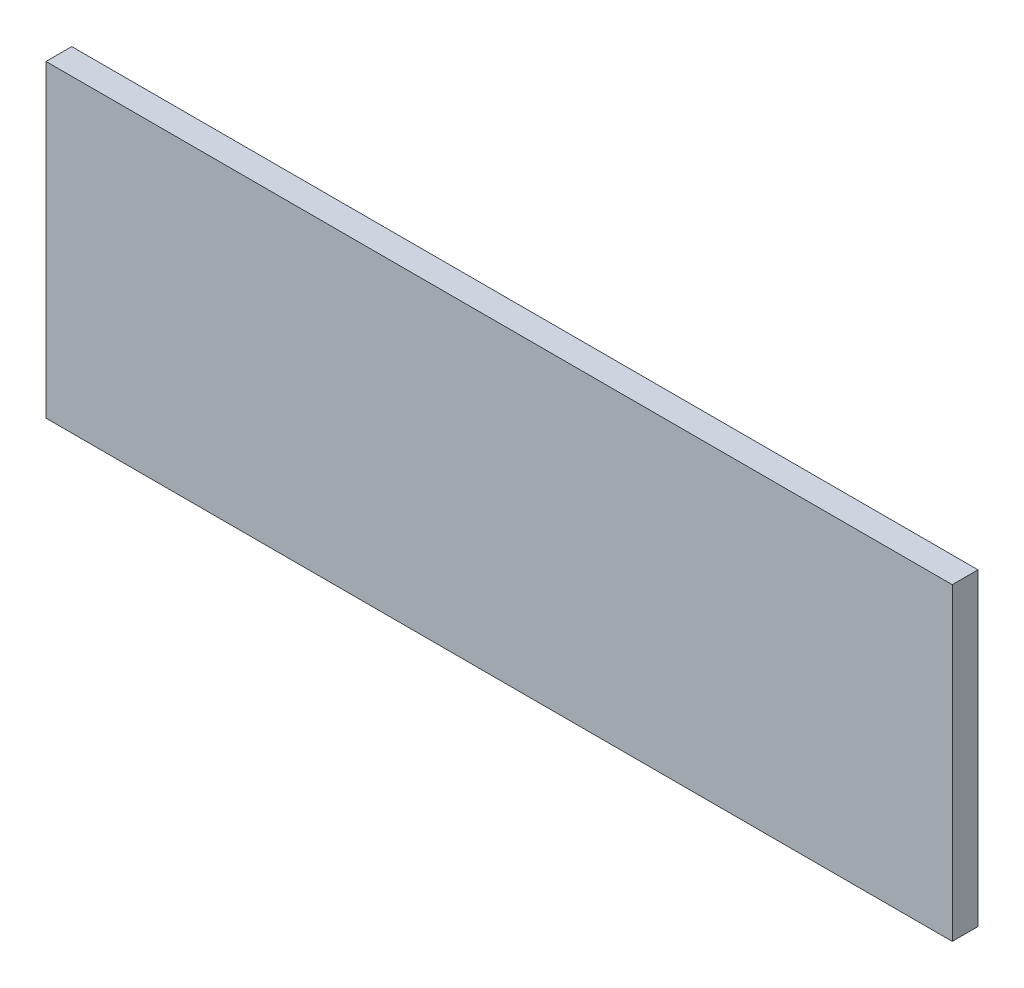
ISO-10303-21;
HEADER;
FILE_DESCRIPTION(('STEP AP214'),'2;1');
FILE_NAME('part.step','',(''),(''),'','','');
FILE_SCHEMA(('AUTOMOTIVE_DESIGN { 1 0 10303 214 1 1 1 1 }'));
ENDSEC;
DATA;
#1=APPLICATION_CONTEXT('core data for automotive mechanical design processes');
#2=APPLICATION_PROTOCOL_DEFINITION('international standard','automotive_design',2000,#1);
#3=PRODUCT_CONTEXT('',#1,'mechanical');
#4=PRODUCT('Part','Part','',(#3));
#5=PRODUCT_RELATED_PRODUCT_CATEGORY('part','',(#4));
#6=PRODUCT_DEFINITION_FORMATION('','',#4);
#7=PRODUCT_DEFINITION_CONTEXT('part definition',#1,'design');
#8=PRODUCT_DEFINITION('design','',#6,#7);
#9=PRODUCT_DEFINITION_SHAPE('','',#8);
#10=(LENGTH_UNIT() NAMED_UNIT(*) SI_UNIT(.MILLI.,.METRE.));
#11=(NAMED_UNIT(*) PLANE_ANGLE_UNIT() SI_UNIT($,.RADIAN.));
#12=(NAMED_UNIT(*) SI_UNIT($,.STERADIAN.) SOLID_ANGLE_UNIT());
#13=UNCERTAINTY_MEASURE_WITH_UNIT(LENGTH_MEASURE(1.E-05),#10,'distance_accuracy_value','');
#14=(GEOMETRIC_REPRESENTATION_CONTEXT(3) GLOBAL_UNCERTAINTY_ASSIGNED_CONTEXT((#13)) GLOBAL_UNIT_ASSIGNED_CONTEXT((#10,
#11,#12)) REPRESENTATION_CONTEXT('',''));
#15=CARTESIAN_POINT('',(0.,0.,0.));
#16=DIRECTION('',(0.,0.,1.));
#17=DIRECTION('',(1.,0.,0.));
#18=AXIS2_PLACEMENT_3D('',#15,#16,#17);
#19=CARTESIAN_POINT('',(88.,-30.,5.));
#20=DIRECTION('',(-1.,0.,0.));
#21=DIRECTION('',(0.,0.,1.));
#22=AXIS2_PLACEMENT_3D('',#19,#20,#21);
#23=PLANE('',#22);
#24=DIRECTION('',(0.,1.,0.));
#25=VECTOR('',#24,1.);
#26=CARTESIAN_POINT('',(88.,-30.,0.));
#27=LINE('',#26,#25);
#28=CARTESIAN_POINT('',(88.,-30.,0.));
#29=VERTEX_POINT('',#28);
#30=CARTESIAN_POINT('',(88.,30.,0.));
#31=VERTEX_POINT('',#30);
#32=EDGE_CURVE('E96',#29,#31,#27,.T.);
#33=ORIENTED_EDGE('',*,*,#32,.T.);
#34=DIRECTION('',(0.,0.,-1.));
#35=VECTOR('',#34,1.);
#36=CARTESIAN_POINT('',(88.,30.,5.));
#37=LINE('',#36,#35);
#38=CARTESIAN_POINT('',(88.,30.,5.));
#39=VERTEX_POINT('',#38);
#40=EDGE_CURVE('E11',#39,#31,#37,.T.);
#41=ORIENTED_EDGE('',*,*,#40,.F.);
#42=DIRECTION('',(0.,1.,0.));
#43=VECTOR('',#42,1.);
#44=CARTESIAN_POINT('',(88.,-30.,5.));
#45=LINE('',#44,#43);
#46=CARTESIAN_POINT('',(88.,-30.,5.));
#47=VERTEX_POINT('',#46);
#48=EDGE_CURVE('E84',#47,#39,#45,.T.);
#49=ORIENTED_EDGE('',*,*,#48,.F.);
#50=DIRECTION('',(0.,0.,-1.));
#51=VECTOR('',#50,1.);
#52=CARTESIAN_POINT('',(88.,-30.,5.));
#53=LINE('',#52,#51);
#54=EDGE_CURVE('E92',#47,#29,#53,.T.);
#55=ORIENTED_EDGE('',*,*,#54,.T.);
#56=EDGE_LOOP('',(#33,#41,#49,#55));
#57=FACE_BOUND('',#56,.T.);
#58=ADVANCED_FACE('F33',(#57),#23,.F.);
#59=CARTESIAN_POINT('',(-88.,30.,5.));
#60=DIRECTION('',(0.,-1.,0.));
#61=DIRECTION('',(0.,0.,-1.));
#62=AXIS2_PLACEMENT_3D('',#59,#60,#61);
#63=PLANE('',#62);
#64=DIRECTION('',(-1.,0.,0.));
#65=VECTOR('',#64,1.);
#66=CARTESIAN_POINT('',(-88.,30.,0.));
#67=LINE('',#66,#65);
#68=CARTESIAN_POINT('',(-88.,30.,0.));
#69=VERTEX_POINT('',#68);
#70=EDGE_CURVE('E88',#31,#69,#67,.T.);
#71=ORIENTED_EDGE('',*,*,#70,.T.);
#72=DIRECTION('',(0.,0.,-1.));
#73=VECTOR('',#72,1.);
#74=CARTESIAN_POINT('',(-88.,30.,5.));
#75=LINE('',#74,#73);
#76=CARTESIAN_POINT('',(-88.,30.,5.));
#77=VERTEX_POINT('',#76);
#78=EDGE_CURVE('E41',#77,#69,#75,.T.);
#79=ORIENTED_EDGE('',*,*,#78,.F.);
#80=DIRECTION('',(-1.,0.,0.));
#81=VECTOR('',#80,1.);
#82=CARTESIAN_POINT('',(-88.,30.,5.));
#83=LINE('',#82,#81);
#84=EDGE_CURVE('E79',#39,#77,#83,.T.);
#85=ORIENTED_EDGE('',*,*,#84,.F.);
#86=ORIENTED_EDGE('',*,*,#40,.T.);
#87=EDGE_LOOP('',(#71,#79,#85,#86));
#88=FACE_BOUND('',#87,.T.);
#89=ADVANCED_FACE('F87',(#88),#63,.F.);
#90=CARTESIAN_POINT('',(-88.,-30.,5.));
#91=DIRECTION('',(1.,0.,0.));
#92=DIRECTION('',(0.,0.,-1.));
#93=AXIS2_PLACEMENT_3D('',#90,#91,#92);
#94=PLANE('',#93);
#95=DIRECTION('',(0.,-1.,0.));
#96=VECTOR('',#95,1.);
#97=CARTESIAN_POINT('',(-88.,-30.,0.));
#98=LINE('',#97,#96);
#99=CARTESIAN_POINT('',(-88.,-30.,0.));
#100=VERTEX_POINT('',#99);
#101=EDGE_CURVE('E66',#69,#100,#98,.T.);
#102=ORIENTED_EDGE('',*,*,#101,.T.);
#103=DIRECTION('',(0.,0.,-1.));
#104=VECTOR('',#103,1.);
#105=CARTESIAN_POINT('',(-88.,-30.,5.));
#106=LINE('',#105,#104);
#107=CARTESIAN_POINT('',(-88.,-30.,5.));
#108=VERTEX_POINT('',#107);
#109=EDGE_CURVE('E89',#108,#100,#106,.T.);
#110=ORIENTED_EDGE('',*,*,#109,.F.);
#111=DIRECTION('',(0.,-1.,0.));
#112=VECTOR('',#111,1.);
#113=CARTESIAN_POINT('',(-88.,-30.,5.));
#114=LINE('',#113,#112);
#115=EDGE_CURVE('E82',#77,#108,#114,.T.);
#116=ORIENTED_EDGE('',*,*,#115,.F.);
#117=ORIENTED_EDGE('',*,*,#78,.T.);
#118=EDGE_LOOP('',(#102,#110,#116,#117));
#119=FACE_BOUND('',#118,.T.);
#120=ADVANCED_FACE('F90',(#119),#94,.F.);
#121=CARTESIAN_POINT('',(-88.,-30.,5.));
#122=DIRECTION('',(0.,1.,0.));
#123=DIRECTION('',(0.,0.,1.));
#124=AXIS2_PLACEMENT_3D('',#121,#122,#123);
#125=PLANE('',#124);
#126=DIRECTION('',(1.,0.,0.));
#127=VECTOR('',#126,1.);
#128=CARTESIAN_POINT('',(-88.,-30.,0.));
#129=LINE('',#128,#127);
#130=EDGE_CURVE('E72',#100,#29,#129,.T.);
#131=ORIENTED_EDGE('',*,*,#130,.T.);
#132=ORIENTED_EDGE('',*,*,#54,.F.);
#133=DIRECTION('',(1.,0.,0.));
#134=VECTOR('',#133,1.);
#135=CARTESIAN_POINT('',(-88.,-30.,5.));
#136=LINE('',#135,#134);
#137=EDGE_CURVE('E49',#108,#47,#136,.T.);
#138=ORIENTED_EDGE('',*,*,#137,.F.);
#139=ORIENTED_EDGE('',*,*,#109,.T.);
#140=EDGE_LOOP('',(#131,#132,#138,#139));
#141=FACE_BOUND('',#140,.T.);
#142=ADVANCED_FACE('F103',(#141),#125,.F.);
#143=CARTESIAN_POINT('',(0.,0.,5.));
#144=DIRECTION('',(0.,0.,-1.));
#145=DIRECTION('',(-1.,0.,0.));
#146=AXIS2_PLACEMENT_3D('',#143,#144,#145);
#147=PLANE('',#146);
#148=ORIENTED_EDGE('',*,*,#48,.T.);
#149=ORIENTED_EDGE('',*,*,#84,.T.);
#150=ORIENTED_EDGE('',*,*,#115,.T.);
#151=ORIENTED_EDGE('',*,*,#137,.T.);
#152=EDGE_LOOP('',(#148,#149,#150,#151));
#153=FACE_BOUND('',#152,.T.);
#154=ADVANCED_FACE('F80',(#153),#147,.F.);
#155=CARTESIAN_POINT('',(0.,0.,0.));
#156=DIRECTION('',(0.,0.,-1.));
#157=DIRECTION('',(-1.,0.,0.));
#158=AXIS2_PLACEMENT_3D('',#155,#156,#157);
#159=PLANE('',#158);
#160=ORIENTED_EDGE('',*,*,#32,.F.);
#161=ORIENTED_EDGE('',*,*,#130,.F.);
#162=ORIENTED_EDGE('',*,*,#101,.F.);
#163=ORIENTED_EDGE('',*,*,#70,.F.);
#164=EDGE_LOOP('',(#160,#161,#162,#163));
#165=FACE_BOUND('',#164,.T.);
#166=ADVANCED_FACE('F106',(#165),#159,.T.);
#167=CLOSED_SHELL('',(#58,#89,#120,#142,#154,#166));
#168=MANIFOLD_SOLID_BREP('B2',#167);
#169=ADVANCED_BREP_SHAPE_REPRESENTATION('',(#18,#168),#14);
#170=SHAPE_DEFINITION_REPRESENTATION(#9,#169);
ENDSEC;
END-ISO-10303-21;
